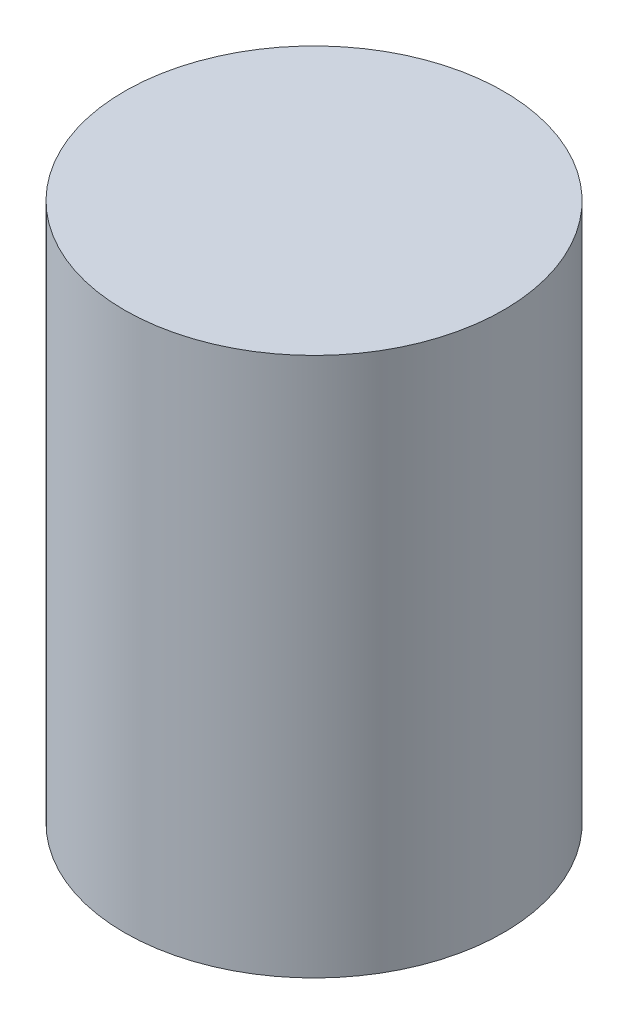
ISO-10303-21;
HEADER;
FILE_DESCRIPTION(('STEP AP214'),'2;1');
FILE_NAME('part.step','',(''),(''),'','','');
FILE_SCHEMA(('AUTOMOTIVE_DESIGN { 1 0 10303 214 1 1 1 1 }'));
ENDSEC;
DATA;
#1=APPLICATION_CONTEXT('core data for automotive mechanical design processes');
#2=APPLICATION_PROTOCOL_DEFINITION('international standard','automotive_design',2000,#1);
#3=PRODUCT_CONTEXT('',#1,'mechanical');
#4=PRODUCT('Part','Part','',(#3));
#5=PRODUCT_RELATED_PRODUCT_CATEGORY('part','',(#4));
#6=PRODUCT_DEFINITION_FORMATION('','',#4);
#7=PRODUCT_DEFINITION_CONTEXT('part definition',#1,'design');
#8=PRODUCT_DEFINITION('design','',#6,#7);
#9=PRODUCT_DEFINITION_SHAPE('','',#8);
#10=(LENGTH_UNIT() NAMED_UNIT(*) SI_UNIT(.MILLI.,.METRE.));
#11=(NAMED_UNIT(*) PLANE_ANGLE_UNIT() SI_UNIT($,.RADIAN.));
#12=(NAMED_UNIT(*) SI_UNIT($,.STERADIAN.) SOLID_ANGLE_UNIT());
#13=UNCERTAINTY_MEASURE_WITH_UNIT(LENGTH_MEASURE(1.E-05),#10,'distance_accuracy_value','');
#14=(GEOMETRIC_REPRESENTATION_CONTEXT(3) GLOBAL_UNCERTAINTY_ASSIGNED_CONTEXT((#13)) GLOBAL_UNIT_ASSIGNED_CONTEXT((#10,
#11,#12)) REPRESENTATION_CONTEXT('',''));
#15=CARTESIAN_POINT('',(0.,0.,0.));
#16=DIRECTION('',(0.,0.,1.));
#17=DIRECTION('',(1.,0.,0.));
#18=AXIS2_PLACEMENT_3D('',#15,#16,#17);
#19=CARTESIAN_POINT('',(0.,32.,0.));
#20=DIRECTION('',(0.,-1.,0.));
#21=DIRECTION('',(0.,0.,-1.));
#22=AXIS2_PLACEMENT_3D('',#19,#20,#21);
#23=CYLINDRICAL_SURFACE('',#22,11.25);
#24=CARTESIAN_POINT('',(0.,32.,0.));
#25=DIRECTION('',(0.,1.,0.));
#26=DIRECTION('',(0.,0.,1.));
#27=AXIS2_PLACEMENT_3D('',#24,#25,#26);
#28=CIRCLE('',#27,11.25);
#29=CARTESIAN_POINT('',(0.,32.,11.25));
#30=VERTEX_POINT('',#29);
#31=EDGE_CURVE('E10',#30,#30,#28,.T.);
#32=ORIENTED_EDGE('',*,*,#31,.F.);
#33=EDGE_LOOP('',(#32));
#34=FACE_BOUND('',#33,.T.);
#35=CARTESIAN_POINT('',(0.,0.,0.));
#36=DIRECTION('',(0.,1.,0.));
#37=DIRECTION('',(0.,0.,1.));
#38=AXIS2_PLACEMENT_3D('',#35,#36,#37);
#39=CIRCLE('',#38,11.25);
#40=CARTESIAN_POINT('',(0.,0.,11.25));
#41=VERTEX_POINT('',#40);
#42=EDGE_CURVE('E38',#41,#41,#39,.T.);
#43=ORIENTED_EDGE('',*,*,#42,.T.);
#44=EDGE_LOOP('',(#43));
#45=FACE_BOUND('',#44,.T.);
#46=ADVANCED_FACE('F35',(#34,#45),#23,.T.);
#47=CARTESIAN_POINT('',(0.,32.,0.));
#48=DIRECTION('',(0.,1.,0.));
#49=DIRECTION('',(0.,0.,1.));
#50=AXIS2_PLACEMENT_3D('',#47,#48,#49);
#51=PLANE('',#50);
#52=ORIENTED_EDGE('',*,*,#31,.T.);
#53=EDGE_LOOP('',(#52));
#54=FACE_BOUND('',#53,.T.);
#55=ADVANCED_FACE('F50',(#54),#51,.T.);
#56=CARTESIAN_POINT('',(0.,0.,0.));
#57=DIRECTION('',(0.,1.,0.));
#58=DIRECTION('',(0.,0.,1.));
#59=AXIS2_PLACEMENT_3D('',#56,#57,#58);
#60=PLANE('',#59);
#61=ORIENTED_EDGE('',*,*,#42,.F.);
#62=EDGE_LOOP('',(#61));
#63=FACE_BOUND('',#62,.T.);
#64=ADVANCED_FACE('F48',(#63),#60,.F.);
#65=CLOSED_SHELL('',(#46,#55,#64));
#66=MANIFOLD_SOLID_BREP('B2',#65);
#67=ADVANCED_BREP_SHAPE_REPRESENTATION('',(#18,#66),#14);
#68=SHAPE_DEFINITION_REPRESENTATION(#9,#67);
ENDSEC;
END-ISO-10303-21;
